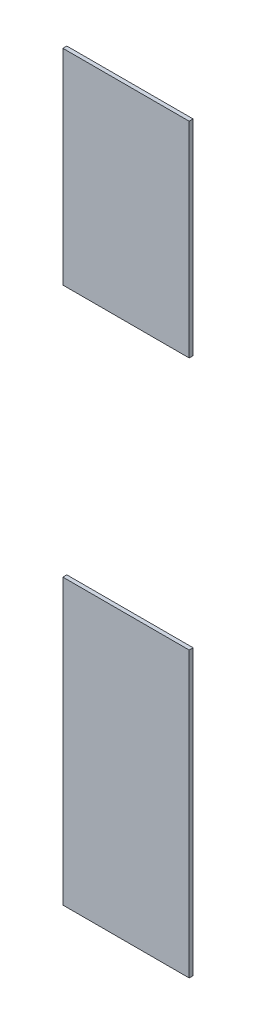
ISO-10303-21;
HEADER;
FILE_DESCRIPTION(('STEP AP214'),'2;1');
FILE_NAME('part.step','',(''),(''),'','','');
FILE_SCHEMA(('AUTOMOTIVE_DESIGN { 1 0 10303 214 1 1 1 1 }'));
ENDSEC;
DATA;
#1=APPLICATION_CONTEXT('core data for automotive mechanical design processes');
#2=APPLICATION_PROTOCOL_DEFINITION('international standard','automotive_design',2000,#1);
#3=PRODUCT_CONTEXT('',#1,'mechanical');
#4=PRODUCT('Part','Part','',(#3));
#5=PRODUCT_RELATED_PRODUCT_CATEGORY('part','',(#4));
#6=PRODUCT_DEFINITION_FORMATION('','',#4);
#7=PRODUCT_DEFINITION_CONTEXT('part definition',#1,'design');
#8=PRODUCT_DEFINITION('design','',#6,#7);
#9=PRODUCT_DEFINITION_SHAPE('','',#8);
#10=(LENGTH_UNIT() NAMED_UNIT(*) SI_UNIT(.MILLI.,.METRE.));
#11=(NAMED_UNIT(*) PLANE_ANGLE_UNIT() SI_UNIT($,.RADIAN.));
#12=(NAMED_UNIT(*) SI_UNIT($,.STERADIAN.) SOLID_ANGLE_UNIT());
#13=UNCERTAINTY_MEASURE_WITH_UNIT(LENGTH_MEASURE(1.E-05),#10,'distance_accuracy_value','');
#14=(GEOMETRIC_REPRESENTATION_CONTEXT(3) GLOBAL_UNCERTAINTY_ASSIGNED_CONTEXT((#13)) GLOBAL_UNIT_ASSIGNED_CONTEXT((#10,
#11,#12)) REPRESENTATION_CONTEXT('',''));
#15=CARTESIAN_POINT('',(0.,0.,0.));
#16=DIRECTION('',(0.,0.,1.));
#17=DIRECTION('',(1.,0.,0.));
#18=AXIS2_PLACEMENT_3D('',#15,#16,#17);
#19=CARTESIAN_POINT('',(-3.40005801291454E-13,-2349.25,12.5));
#20=DIRECTION('',(1.,0.,0.));
#21=DIRECTION('',(0.,0.,-1.));
#22=AXIS2_PLACEMENT_3D('',#19,#20,#21);
#23=PLANE('',#22);
#24=DIRECTION('',(0.,-1.,0.));
#25=VECTOR('',#24,1.);
#26=CARTESIAN_POINT('',(-3.40005801291454E-13,-2349.25,0.));
#27=LINE('',#26,#25);
#28=CARTESIAN_POINT('',(-3.40005801291454E-13,-1450.,0.));
#29=VERTEX_POINT('',#28);
#30=CARTESIAN_POINT('',(-3.40005801291454E-13,-2349.25,0.));
#31=VERTEX_POINT('',#30);
#32=EDGE_CURVE('E108',#29,#31,#27,.T.);
#33=ORIENTED_EDGE('',*,*,#32,.T.);
#34=DIRECTION('',(0.,0.,-1.));
#35=VECTOR('',#34,1.);
#36=CARTESIAN_POINT('',(-3.40005801291454E-13,-2349.25,12.5));
#37=LINE('',#36,#35);
#38=CARTESIAN_POINT('',(-3.40005801291454E-13,-2349.25,12.5));
#39=VERTEX_POINT('',#38);
#40=EDGE_CURVE('E12',#39,#31,#37,.T.);
#41=ORIENTED_EDGE('',*,*,#40,.F.);
#42=DIRECTION('',(0.,-1.,0.));
#43=VECTOR('',#42,1.);
#44=CARTESIAN_POINT('',(-3.40005801291454E-13,-2349.25,12.5));
#45=LINE('',#44,#43);
#46=CARTESIAN_POINT('',(-3.40005801291454E-13,-1450.,12.5));
#47=VERTEX_POINT('',#46);
#48=EDGE_CURVE('E96',#47,#39,#45,.T.);
#49=ORIENTED_EDGE('',*,*,#48,.F.);
#50=DIRECTION('',(0.,0.,-1.));
#51=VECTOR('',#50,1.);
#52=CARTESIAN_POINT('',(-3.40005801291454E-13,-1450.,12.5));
#53=LINE('',#52,#51);
#54=EDGE_CURVE('E104',#47,#29,#53,.T.);
#55=ORIENTED_EDGE('',*,*,#54,.T.);
#56=EDGE_LOOP('',(#33,#41,#49,#55));
#57=FACE_BOUND('',#56,.T.);
#58=ADVANCED_FACE('F45',(#57),#23,.F.);
#59=CARTESIAN_POINT('',(-3.40005801291454E-13,-2349.25,12.5));
#60=DIRECTION('',(0.,1.,0.));
#61=DIRECTION('',(0.,0.,1.));
#62=AXIS2_PLACEMENT_3D('',#59,#60,#61);
#63=PLANE('',#62);
#64=DIRECTION('',(1.,0.,0.));
#65=VECTOR('',#64,1.);
#66=CARTESIAN_POINT('',(-3.40005801291454E-13,-2349.25,0.));
#67=LINE('',#66,#65);
#68=CARTESIAN_POINT('',(400.,-2349.25,0.));
#69=VERTEX_POINT('',#68);
#70=EDGE_CURVE('E100',#31,#69,#67,.T.);
#71=ORIENTED_EDGE('',*,*,#70,.T.);
#72=DIRECTION('',(0.,0.,-1.));
#73=VECTOR('',#72,1.);
#74=CARTESIAN_POINT('',(400.,-2349.25,12.5));
#75=LINE('',#74,#73);
#76=CARTESIAN_POINT('',(400.,-2349.25,12.5));
#77=VERTEX_POINT('',#76);
#78=EDGE_CURVE('E53',#77,#69,#75,.T.);
#79=ORIENTED_EDGE('',*,*,#78,.F.);
#80=DIRECTION('',(1.,0.,0.));
#81=VECTOR('',#80,1.);
#82=CARTESIAN_POINT('',(-3.40005801291454E-13,-2349.25,12.5));
#83=LINE('',#82,#81);
#84=EDGE_CURVE('E91',#39,#77,#83,.T.);
#85=ORIENTED_EDGE('',*,*,#84,.F.);
#86=ORIENTED_EDGE('',*,*,#40,.T.);
#87=EDGE_LOOP('',(#71,#79,#85,#86));
#88=FACE_BOUND('',#87,.T.);
#89=ADVANCED_FACE('F99',(#88),#63,.F.);
#90=CARTESIAN_POINT('',(400.,-2349.25,12.5));
#91=DIRECTION('',(-1.,0.,0.));
#92=DIRECTION('',(0.,0.,1.));
#93=AXIS2_PLACEMENT_3D('',#90,#91,#92);
#94=PLANE('',#93);
#95=DIRECTION('',(0.,1.,0.));
#96=VECTOR('',#95,1.);
#97=CARTESIAN_POINT('',(400.,-2349.25,0.));
#98=LINE('',#97,#96);
#99=CARTESIAN_POINT('',(400.,-1450.,0.));
#100=VERTEX_POINT('',#99);
#101=EDGE_CURVE('E78',#69,#100,#98,.T.);
#102=ORIENTED_EDGE('',*,*,#101,.T.);
#103=DIRECTION('',(0.,0.,-1.));
#104=VECTOR('',#103,1.);
#105=CARTESIAN_POINT('',(400.,-1450.,12.5));
#106=LINE('',#105,#104);
#107=CARTESIAN_POINT('',(400.,-1450.,12.5));
#108=VERTEX_POINT('',#107);
#109=EDGE_CURVE('E101',#108,#100,#106,.T.);
#110=ORIENTED_EDGE('',*,*,#109,.F.);
#111=DIRECTION('',(0.,1.,0.));
#112=VECTOR('',#111,1.);
#113=CARTESIAN_POINT('',(400.,-2349.25,12.5));
#114=LINE('',#113,#112);
#115=EDGE_CURVE('E94',#77,#108,#114,.T.);
#116=ORIENTED_EDGE('',*,*,#115,.F.);
#117=ORIENTED_EDGE('',*,*,#78,.T.);
#118=EDGE_LOOP('',(#102,#110,#116,#117));
#119=FACE_BOUND('',#118,.T.);
#120=ADVANCED_FACE('F102',(#119),#94,.F.);
#121=CARTESIAN_POINT('',(-3.40005801291454E-13,-1450.,12.5));
#122=DIRECTION('',(0.,-1.,0.));
#123=DIRECTION('',(0.,0.,-1.));
#124=AXIS2_PLACEMENT_3D('',#121,#122,#123);
#125=PLANE('',#124);
#126=DIRECTION('',(-1.,0.,0.));
#127=VECTOR('',#126,1.);
#128=CARTESIAN_POINT('',(-3.40005801291454E-13,-1450.,0.));
#129=LINE('',#128,#127);
#130=EDGE_CURVE('E84',#100,#29,#129,.T.);
#131=ORIENTED_EDGE('',*,*,#130,.T.);
#132=ORIENTED_EDGE('',*,*,#54,.F.);
#133=DIRECTION('',(-1.,0.,0.));
#134=VECTOR('',#133,1.);
#135=CARTESIAN_POINT('',(-3.40005801291454E-13,-1450.,12.5));
#136=LINE('',#135,#134);
#137=EDGE_CURVE('E61',#108,#47,#136,.T.);
#138=ORIENTED_EDGE('',*,*,#137,.F.);
#139=ORIENTED_EDGE('',*,*,#109,.T.);
#140=EDGE_LOOP('',(#131,#132,#138,#139));
#141=FACE_BOUND('',#140,.T.);
#142=ADVANCED_FACE('F115',(#141),#125,.F.);
#143=CARTESIAN_POINT('',(0.,0.,12.5));
#144=DIRECTION('',(0.,0.,-1.));
#145=DIRECTION('',(-1.,0.,0.));
#146=AXIS2_PLACEMENT_3D('',#143,#144,#145);
#147=PLANE('',#146);
#148=ORIENTED_EDGE('',*,*,#48,.T.);
#149=ORIENTED_EDGE('',*,*,#84,.T.);
#150=ORIENTED_EDGE('',*,*,#115,.T.);
#151=ORIENTED_EDGE('',*,*,#137,.T.);
#152=EDGE_LOOP('',(#148,#149,#150,#151));
#153=FACE_BOUND('',#152,.T.);
#154=ADVANCED_FACE('F92',(#153),#147,.F.);
#155=CARTESIAN_POINT('',(0.,0.,0.));
#156=DIRECTION('',(0.,0.,-1.));
#157=DIRECTION('',(-1.,0.,0.));
#158=AXIS2_PLACEMENT_3D('',#155,#156,#157);
#159=PLANE('',#158);
#160=ORIENTED_EDGE('',*,*,#32,.F.);
#161=ORIENTED_EDGE('',*,*,#130,.F.);
#162=ORIENTED_EDGE('',*,*,#101,.F.);
#163=ORIENTED_EDGE('',*,*,#70,.F.);
#164=EDGE_LOOP('',(#160,#161,#162,#163));
#165=FACE_BOUND('',#164,.T.);
#166=ADVANCED_FACE('F118',(#165),#159,.T.);
#167=CLOSED_SHELL('',(#58,#89,#120,#142,#154,#166));
#168=MANIFOLD_SOLID_BREP('B2',#167);
#169=CARTESIAN_POINT('',(0.,0.,12.5));
#170=DIRECTION('',(1.,0.,0.));
#171=DIRECTION('',(0.,0.,-1.));
#172=AXIS2_PLACEMENT_3D('',#169,#170,#171);
#173=PLANE('',#172);
#174=DIRECTION('',(0.,-1.,0.));
#175=VECTOR('',#174,1.);
#176=CARTESIAN_POINT('',(0.,0.,0.));
#177=LINE('',#176,#175);
#178=CARTESIAN_POINT('',(0.,0.,0.));
#179=VERTEX_POINT('',#178);
#180=CARTESIAN_POINT('',(0.,-649.25,0.));
#181=VERTEX_POINT('',#180);
#182=EDGE_CURVE('E232',#179,#181,#177,.T.);
#183=ORIENTED_EDGE('',*,*,#182,.T.);
#184=DIRECTION('',(0.,0.,-1.));
#185=VECTOR('',#184,1.);
#186=CARTESIAN_POINT('',(0.,-649.25,12.5));
#187=LINE('',#186,#185);
#188=CARTESIAN_POINT('',(0.,-649.25,12.5));
#189=VERTEX_POINT('',#188);
#190=EDGE_CURVE('E43',#189,#181,#187,.T.);
#191=ORIENTED_EDGE('',*,*,#190,.F.);
#192=DIRECTION('',(0.,-1.,0.));
#193=VECTOR('',#192,1.);
#194=CARTESIAN_POINT('',(0.,0.,12.5));
#195=LINE('',#194,#193);
#196=CARTESIAN_POINT('',(0.,0.,12.5));
#197=VERTEX_POINT('',#196);
#198=EDGE_CURVE('E220',#197,#189,#195,.T.);
#199=ORIENTED_EDGE('',*,*,#198,.F.);
#200=DIRECTION('',(0.,0.,-1.));
#201=VECTOR('',#200,1.);
#202=CARTESIAN_POINT('',(0.,0.,12.5));
#203=LINE('',#202,#201);
#204=EDGE_CURVE('E228',#197,#179,#203,.T.);
#205=ORIENTED_EDGE('',*,*,#204,.T.);
#206=EDGE_LOOP('',(#183,#191,#199,#205));
#207=FACE_BOUND('',#206,.T.);
#208=ADVANCED_FACE('F169',(#207),#173,.F.);
#209=CARTESIAN_POINT('',(0.,-649.25,12.5));
#210=DIRECTION('',(0.,1.,0.));
#211=DIRECTION('',(0.,0.,1.));
#212=AXIS2_PLACEMENT_3D('',#209,#210,#211);
#213=PLANE('',#212);
#214=DIRECTION('',(1.,0.,0.));
#215=VECTOR('',#214,1.);
#216=CARTESIAN_POINT('',(0.,-649.25,0.));
#217=LINE('',#216,#215);
#218=CARTESIAN_POINT('',(400.,-649.25,0.));
#219=VERTEX_POINT('',#218);
#220=EDGE_CURVE('E224',#181,#219,#217,.T.);
#221=ORIENTED_EDGE('',*,*,#220,.T.);
#222=DIRECTION('',(0.,0.,-1.));
#223=VECTOR('',#222,1.);
#224=CARTESIAN_POINT('',(400.,-649.25,12.5));
#225=LINE('',#224,#223);
#226=CARTESIAN_POINT('',(400.,-649.25,12.5));
#227=VERTEX_POINT('',#226);
#228=EDGE_CURVE('E177',#227,#219,#225,.T.);
#229=ORIENTED_EDGE('',*,*,#228,.F.);
#230=DIRECTION('',(1.,0.,0.));
#231=VECTOR('',#230,1.);
#232=CARTESIAN_POINT('',(0.,-649.25,12.5));
#233=LINE('',#232,#231);
#234=EDGE_CURVE('E215',#189,#227,#233,.T.);
#235=ORIENTED_EDGE('',*,*,#234,.F.);
#236=ORIENTED_EDGE('',*,*,#190,.T.);
#237=EDGE_LOOP('',(#221,#229,#235,#236));
#238=FACE_BOUND('',#237,.T.);
#239=ADVANCED_FACE('F223',(#238),#213,.F.);
#240=CARTESIAN_POINT('',(400.,0.,12.5));
#241=DIRECTION('',(-1.,0.,0.));
#242=DIRECTION('',(0.,0.,1.));
#243=AXIS2_PLACEMENT_3D('',#240,#241,#242);
#244=PLANE('',#243);
#245=DIRECTION('',(0.,1.,0.));
#246=VECTOR('',#245,1.);
#247=CARTESIAN_POINT('',(400.,0.,0.));
#248=LINE('',#247,#246);
#249=CARTESIAN_POINT('',(400.,0.,0.));
#250=VERTEX_POINT('',#249);
#251=EDGE_CURVE('E202',#219,#250,#248,.T.);
#252=ORIENTED_EDGE('',*,*,#251,.T.);
#253=DIRECTION('',(0.,0.,-1.));
#254=VECTOR('',#253,1.);
#255=CARTESIAN_POINT('',(400.,0.,12.5));
#256=LINE('',#255,#254);
#257=CARTESIAN_POINT('',(400.,0.,12.5));
#258=VERTEX_POINT('',#257);
#259=EDGE_CURVE('E225',#258,#250,#256,.T.);
#260=ORIENTED_EDGE('',*,*,#259,.F.);
#261=DIRECTION('',(0.,1.,0.));
#262=VECTOR('',#261,1.);
#263=CARTESIAN_POINT('',(400.,0.,12.5));
#264=LINE('',#263,#262);
#265=EDGE_CURVE('E218',#227,#258,#264,.T.);
#266=ORIENTED_EDGE('',*,*,#265,.F.);
#267=ORIENTED_EDGE('',*,*,#228,.T.);
#268=EDGE_LOOP('',(#252,#260,#266,#267));
#269=FACE_BOUND('',#268,.T.);
#270=ADVANCED_FACE('F226',(#269),#244,.F.);
#271=CARTESIAN_POINT('',(0.,0.,12.5));
#272=DIRECTION('',(0.,-1.,0.));
#273=DIRECTION('',(0.,0.,-1.));
#274=AXIS2_PLACEMENT_3D('',#271,#272,#273);
#275=PLANE('',#274);
#276=DIRECTION('',(-1.,0.,0.));
#277=VECTOR('',#276,1.);
#278=CARTESIAN_POINT('',(0.,0.,0.));
#279=LINE('',#278,#277);
#280=EDGE_CURVE('E208',#250,#179,#279,.T.);
#281=ORIENTED_EDGE('',*,*,#280,.T.);
#282=ORIENTED_EDGE('',*,*,#204,.F.);
#283=DIRECTION('',(-1.,0.,0.));
#284=VECTOR('',#283,1.);
#285=CARTESIAN_POINT('',(0.,0.,12.5));
#286=LINE('',#285,#284);
#287=EDGE_CURVE('E185',#258,#197,#286,.T.);
#288=ORIENTED_EDGE('',*,*,#287,.F.);
#289=ORIENTED_EDGE('',*,*,#259,.T.);
#290=EDGE_LOOP('',(#281,#282,#288,#289));
#291=FACE_BOUND('',#290,.T.);
#292=ADVANCED_FACE('F239',(#291),#275,.F.);
#293=CARTESIAN_POINT('',(0.,0.,12.5));
#294=DIRECTION('',(0.,0.,1.));
#295=DIRECTION('',(1.,0.,0.));
#296=AXIS2_PLACEMENT_3D('',#293,#294,#295);
#297=PLANE('',#296);
#298=ORIENTED_EDGE('',*,*,#198,.T.);
#299=ORIENTED_EDGE('',*,*,#234,.T.);
#300=ORIENTED_EDGE('',*,*,#265,.T.);
#301=ORIENTED_EDGE('',*,*,#287,.T.);
#302=EDGE_LOOP('',(#298,#299,#300,#301));
#303=FACE_BOUND('',#302,.T.);
#304=ADVANCED_FACE('F216',(#303),#297,.T.);
#305=CARTESIAN_POINT('',(0.,0.,0.));
#306=DIRECTION('',(0.,0.,1.));
#307=DIRECTION('',(1.,0.,0.));
#308=AXIS2_PLACEMENT_3D('',#305,#306,#307);
#309=PLANE('',#308);
#310=ORIENTED_EDGE('',*,*,#182,.F.);
#311=ORIENTED_EDGE('',*,*,#280,.F.);
#312=ORIENTED_EDGE('',*,*,#251,.F.);
#313=ORIENTED_EDGE('',*,*,#220,.F.);
#314=EDGE_LOOP('',(#310,#311,#312,#313));
#315=FACE_BOUND('',#314,.T.);
#316=ADVANCED_FACE('F242',(#315),#309,.F.);
#317=CLOSED_SHELL('',(#208,#239,#270,#292,#304,#316));
#318=MANIFOLD_SOLID_BREP('B6',#317);
#319=ADVANCED_BREP_SHAPE_REPRESENTATION('',(#18,#168,#318),#14);
#320=SHAPE_DEFINITION_REPRESENTATION(#9,#319);
ENDSEC;
END-ISO-10303-21;
